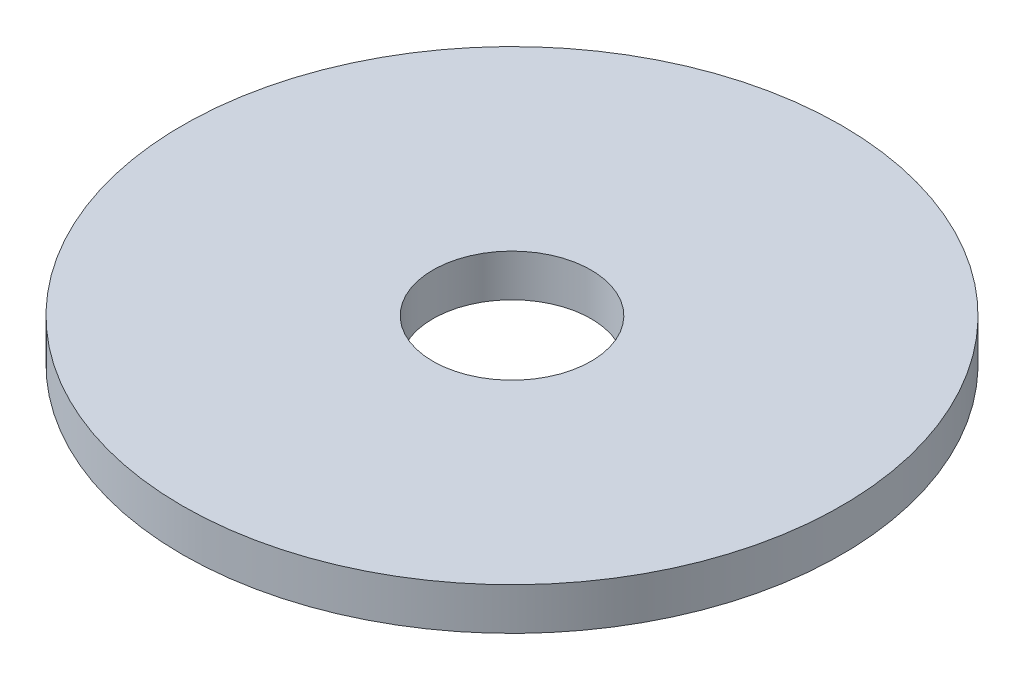
ISO-10303-21;
HEADER;
FILE_DESCRIPTION(('STEP AP214'),'2;1');
FILE_NAME('part.step','',(''),(''),'','','');
FILE_SCHEMA(('AUTOMOTIVE_DESIGN { 1 0 10303 214 1 1 1 1 }'));
ENDSEC;
DATA;
#1=APPLICATION_CONTEXT('core data for automotive mechanical design processes');
#2=APPLICATION_PROTOCOL_DEFINITION('international standard','automotive_design',2000,#1);
#3=PRODUCT_CONTEXT('',#1,'mechanical');
#4=PRODUCT('Part','Part','',(#3));
#5=PRODUCT_RELATED_PRODUCT_CATEGORY('part','',(#4));
#6=PRODUCT_DEFINITION_FORMATION('','',#4);
#7=PRODUCT_DEFINITION_CONTEXT('part definition',#1,'design');
#8=PRODUCT_DEFINITION('design','',#6,#7);
#9=PRODUCT_DEFINITION_SHAPE('','',#8);
#10=(LENGTH_UNIT() NAMED_UNIT(*) SI_UNIT(.MILLI.,.METRE.));
#11=(NAMED_UNIT(*) PLANE_ANGLE_UNIT() SI_UNIT($,.RADIAN.));
#12=(NAMED_UNIT(*) SI_UNIT($,.STERADIAN.) SOLID_ANGLE_UNIT());
#13=UNCERTAINTY_MEASURE_WITH_UNIT(LENGTH_MEASURE(1.E-05),#10,'distance_accuracy_value','');
#14=(GEOMETRIC_REPRESENTATION_CONTEXT(3) GLOBAL_UNCERTAINTY_ASSIGNED_CONTEXT((#13)) GLOBAL_UNIT_ASSIGNED_CONTEXT((#10,
#11,#12)) REPRESENTATION_CONTEXT('',''));
#15=CARTESIAN_POINT('',(0.,0.,0.));
#16=DIRECTION('',(0.,0.,1.));
#17=DIRECTION('',(1.,0.,0.));
#18=AXIS2_PLACEMENT_3D('',#15,#16,#17);
#19=CARTESIAN_POINT('',(0.,1.6,0.));
#20=DIRECTION('',(0.,1.,0.));
#21=DIRECTION('',(0.,0.,1.));
#22=AXIS2_PLACEMENT_3D('',#19,#20,#21);
#23=PLANE('',#22);
#24=CARTESIAN_POINT('',(0.,1.6,0.));
#25=DIRECTION('',(0.,1.,0.));
#26=DIRECTION('',(0.,0.,1.));
#27=AXIS2_PLACEMENT_3D('',#24,#25,#26);
#28=CIRCLE('',#27,12.5);
#29=CARTESIAN_POINT('',(0.,1.6,12.5));
#30=VERTEX_POINT('',#29);
#31=EDGE_CURVE('E10',#30,#30,#28,.T.);
#32=ORIENTED_EDGE('',*,*,#31,.T.);
#33=EDGE_LOOP('',(#32));
#34=FACE_BOUND('',#33,.T.);
#35=CARTESIAN_POINT('',(0.,1.6,0.));
#36=DIRECTION('',(0.,1.,0.));
#37=DIRECTION('',(0.,0.,1.));
#38=AXIS2_PLACEMENT_3D('',#35,#36,#37);
#39=CIRCLE('',#38,3.);
#40=CARTESIAN_POINT('',(0.,1.6,3.));
#41=VERTEX_POINT('',#40);
#42=EDGE_CURVE('E43',#41,#41,#39,.T.);
#43=ORIENTED_EDGE('',*,*,#42,.F.);
#44=EDGE_LOOP('',(#43));
#45=FACE_BOUND('',#44,.T.);
#46=ADVANCED_FACE('F32',(#34,#45),#23,.T.);
#47=CARTESIAN_POINT('',(0.,0.,0.));
#48=DIRECTION('',(0.,1.,0.));
#49=DIRECTION('',(0.,0.,1.));
#50=AXIS2_PLACEMENT_3D('',#47,#48,#49);
#51=PLANE('',#50);
#52=CARTESIAN_POINT('',(0.,0.,0.));
#53=DIRECTION('',(0.,1.,0.));
#54=DIRECTION('',(0.,0.,1.));
#55=AXIS2_PLACEMENT_3D('',#52,#53,#54);
#56=CIRCLE('',#55,12.5);
#57=CARTESIAN_POINT('',(0.,0.,12.5));
#58=VERTEX_POINT('',#57);
#59=EDGE_CURVE('E36',#58,#58,#56,.T.);
#60=ORIENTED_EDGE('',*,*,#59,.F.);
#61=EDGE_LOOP('',(#60));
#62=FACE_BOUND('',#61,.T.);
#63=CARTESIAN_POINT('',(0.,0.,0.));
#64=DIRECTION('',(0.,1.,0.));
#65=DIRECTION('',(0.,0.,1.));
#66=AXIS2_PLACEMENT_3D('',#63,#64,#65);
#67=CIRCLE('',#66,3.);
#68=CARTESIAN_POINT('',(0.,0.,3.));
#69=VERTEX_POINT('',#68);
#70=EDGE_CURVE('E45',#69,#69,#67,.T.);
#71=ORIENTED_EDGE('',*,*,#70,.T.);
#72=EDGE_LOOP('',(#71));
#73=FACE_BOUND('',#72,.T.);
#74=ADVANCED_FACE('F55',(#62,#73),#51,.F.);
#75=CARTESIAN_POINT('',(0.,1.6,0.));
#76=DIRECTION('',(0.,-1.,0.));
#77=DIRECTION('',(0.,0.,-1.));
#78=AXIS2_PLACEMENT_3D('',#75,#76,#77);
#79=CYLINDRICAL_SURFACE('',#78,12.5);
#80=ORIENTED_EDGE('',*,*,#31,.F.);
#81=EDGE_LOOP('',(#80));
#82=FACE_BOUND('',#81,.T.);
#83=ORIENTED_EDGE('',*,*,#59,.T.);
#84=EDGE_LOOP('',(#83));
#85=FACE_BOUND('',#84,.T.);
#86=ADVANCED_FACE('F34',(#82,#85),#79,.T.);
#87=CARTESIAN_POINT('',(0.,1.6,0.));
#88=DIRECTION('',(0.,-1.,0.));
#89=DIRECTION('',(0.,0.,-1.));
#90=AXIS2_PLACEMENT_3D('',#87,#88,#89);
#91=CYLINDRICAL_SURFACE('',#90,3.);
#92=ORIENTED_EDGE('',*,*,#42,.T.);
#93=EDGE_LOOP('',(#92));
#94=FACE_BOUND('',#93,.T.);
#95=ORIENTED_EDGE('',*,*,#70,.F.);
#96=EDGE_LOOP('',(#95));
#97=FACE_BOUND('',#96,.T.);
#98=ADVANCED_FACE('F51',(#94,#97),#91,.F.);
#99=CLOSED_SHELL('',(#46,#74,#86,#98));
#100=MANIFOLD_SOLID_BREP('B2',#99);
#101=ADVANCED_BREP_SHAPE_REPRESENTATION('',(#18,#100),#14);
#102=SHAPE_DEFINITION_REPRESENTATION(#9,#101);
ENDSEC;
END-ISO-10303-21;
